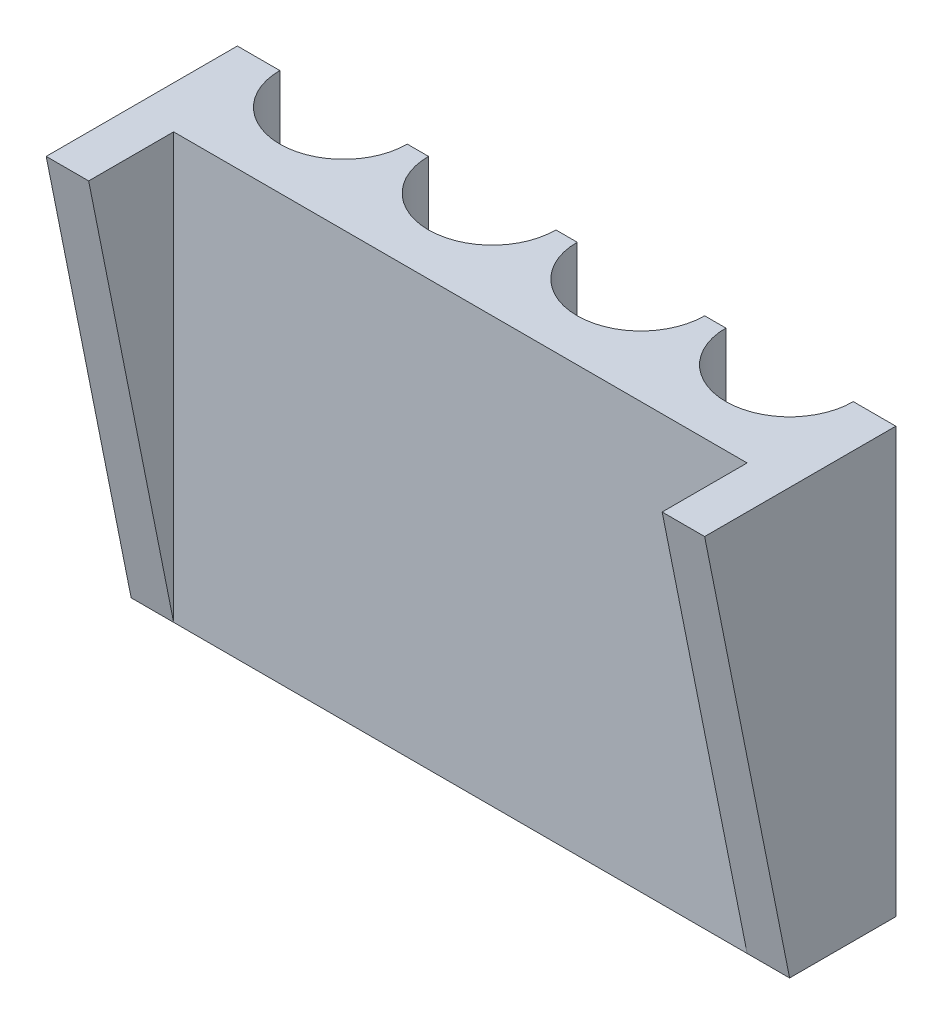
ISO-10303-21;
HEADER;
FILE_DESCRIPTION(('STEP AP214'),'2;1');
FILE_NAME('part.step','',(''),(''),'','','');
FILE_SCHEMA(('AUTOMOTIVE_DESIGN { 1 0 10303 214 1 1 1 1 }'));
ENDSEC;
DATA;
#1=APPLICATION_CONTEXT('core data for automotive mechanical design processes');
#2=APPLICATION_PROTOCOL_DEFINITION('international standard','automotive_design',2000,#1);
#3=PRODUCT_CONTEXT('',#1,'mechanical');
#4=PRODUCT('Part','Part','',(#3));
#5=PRODUCT_RELATED_PRODUCT_CATEGORY('part','',(#4));
#6=PRODUCT_DEFINITION_FORMATION('','',#4);
#7=PRODUCT_DEFINITION_CONTEXT('part definition',#1,'design');
#8=PRODUCT_DEFINITION('design','',#6,#7);
#9=PRODUCT_DEFINITION_SHAPE('','',#8);
#10=(LENGTH_UNIT() NAMED_UNIT(*) SI_UNIT(.MILLI.,.METRE.));
#11=(NAMED_UNIT(*) PLANE_ANGLE_UNIT() SI_UNIT($,.RADIAN.));
#12=(NAMED_UNIT(*) SI_UNIT($,.STERADIAN.) SOLID_ANGLE_UNIT());
#13=UNCERTAINTY_MEASURE_WITH_UNIT(LENGTH_MEASURE(1.E-05),#10,'distance_accuracy_value','');
#14=(GEOMETRIC_REPRESENTATION_CONTEXT(3) GLOBAL_UNCERTAINTY_ASSIGNED_CONTEXT((#13)) GLOBAL_UNIT_ASSIGNED_CONTEXT((#10,
#11,#12)) REPRESENTATION_CONTEXT('',''));
#15=CARTESIAN_POINT('',(0.,0.,0.));
#16=DIRECTION('',(0.,0.,1.));
#17=DIRECTION('',(1.,0.,0.));
#18=AXIS2_PLACEMENT_3D('',#15,#16,#17);
#19=CARTESIAN_POINT('',(-77.4999999999999,100.,-15.));
#20=DIRECTION('',(0.,0.,1.));
#21=DIRECTION('',(1.,0.,0.));
#22=AXIS2_PLACEMENT_3D('',#19,#20,#21);
#23=PLANE('',#22);
#24=DIRECTION('',(-1.,0.,0.));
#25=VECTOR('',#24,1.);
#26=CARTESIAN_POINT('',(38.5000000000001,17.,-15.));
#27=LINE('',#26,#25);
#28=CARTESIAN_POINT('',(-32.4999999999999,17.,-15.));
#29=VERTEX_POINT('',#28);
#30=CARTESIAN_POINT('',(-37.4999999999999,17.,-15.));
#31=VERTEX_POINT('',#30);
#32=EDGE_CURVE('E478',#29,#31,#27,.T.);
#33=ORIENTED_EDGE('',*,*,#32,.F.);
#34=DIRECTION('',(0.,1.,0.));
#35=VECTOR('',#34,1.);
#36=CARTESIAN_POINT('',(-32.4999999999999,10.,-15.));
#37=LINE('',#36,#35);
#38=CARTESIAN_POINT('',(-32.4999999999999,14.,-15.));
#39=VERTEX_POINT('',#38);
#40=EDGE_CURVE('E510',#29,#39,#37,.F.);
#41=ORIENTED_EDGE('',*,*,#40,.T.);
#42=DIRECTION('',(-1.,0.,0.));
#43=VECTOR('',#42,1.);
#44=CARTESIAN_POINT('',(38.5000000000001,14.,-15.));
#45=LINE('',#44,#43);
#46=CARTESIAN_POINT('',(-37.4999999999999,14.,-15.));
#47=VERTEX_POINT('',#46);
#48=EDGE_CURVE('E433',#39,#47,#45,.T.);
#49=ORIENTED_EDGE('',*,*,#48,.T.);
#50=DIRECTION('',(0.,1.,0.));
#51=VECTOR('',#50,1.);
#52=CARTESIAN_POINT('',(-37.5,10.,-15.));
#53=LINE('',#52,#51);
#54=EDGE_CURVE('E521',#47,#31,#53,.T.);
#55=ORIENTED_EDGE('',*,*,#54,.T.);
#56=EDGE_LOOP('',(#33,#41,#49,#55));
#57=FACE_BOUND('',#56,.T.);
#58=ADVANCED_FACE('F33',(#57),#23,.F.);
#59=DIRECTION('',(-1.,0.,0.));
#60=VECTOR('',#59,1.);
#61=CARTESIAN_POINT('',(38.5000000000001,18.,-15.));
#62=LINE('',#61,#60);
#63=CARTESIAN_POINT('',(-32.4999999999999,18.,-15.));
#64=VERTEX_POINT('',#63);
#65=CARTESIAN_POINT('',(-37.5,18.,-15.));
#66=VERTEX_POINT('',#65);
#67=EDGE_CURVE('E481',#64,#66,#62,.T.);
#68=ORIENTED_EDGE('',*,*,#67,.T.);
#69=CARTESIAN_POINT('',(-37.4999999999999,100.,-15.));
#70=VERTEX_POINT('',#69);
#71=EDGE_CURVE('E519',#66,#70,#53,.T.);
#72=ORIENTED_EDGE('',*,*,#71,.T.);
#73=DIRECTION('',(-1.,0.,0.));
#74=VECTOR('',#73,1.);
#75=CARTESIAN_POINT('',(-77.4999999999999,100.,-15.));
#76=LINE('',#75,#74);
#77=CARTESIAN_POINT('',(-32.4999999999999,100.,-15.));
#78=VERTEX_POINT('',#77);
#79=EDGE_CURVE('E580',#78,#70,#76,.T.);
#80=ORIENTED_EDGE('',*,*,#79,.F.);
#81=EDGE_CURVE('E506',#78,#64,#37,.F.);
#82=ORIENTED_EDGE('',*,*,#81,.T.);
#83=EDGE_LOOP('',(#68,#72,#80,#82));
#84=FACE_BOUND('',#83,.T.);
#85=ADVANCED_FACE('F613',(#84),#23,.F.);
#86=CARTESIAN_POINT('',(2.50000000000009,17.,-15.));
#87=VERTEX_POINT('',#86);
#88=CARTESIAN_POINT('',(-2.49999999999993,17.,-15.));
#89=VERTEX_POINT('',#88);
#90=EDGE_CURVE('E477',#87,#89,#27,.T.);
#91=ORIENTED_EDGE('',*,*,#90,.F.);
#92=DIRECTION('',(0.,1.,0.));
#93=VECTOR('',#92,1.);
#94=CARTESIAN_POINT('',(2.50000000000007,10.,-15.));
#95=LINE('',#94,#93);
#96=CARTESIAN_POINT('',(2.50000000000007,14.,-15.));
#97=VERTEX_POINT('',#96);
#98=EDGE_CURVE('E649',#87,#97,#95,.F.);
#99=ORIENTED_EDGE('',*,*,#98,.T.);
#100=CARTESIAN_POINT('',(-2.49999999999994,14.,-15.));
#101=VERTEX_POINT('',#100);
#102=EDGE_CURVE('E432',#97,#101,#45,.T.);
#103=ORIENTED_EDGE('',*,*,#102,.T.);
#104=DIRECTION('',(0.,1.,0.));
#105=VECTOR('',#104,1.);
#106=CARTESIAN_POINT('',(-2.49999999999994,10.,-15.));
#107=LINE('',#106,#105);
#108=EDGE_CURVE('E505',#101,#89,#107,.T.);
#109=ORIENTED_EDGE('',*,*,#108,.T.);
#110=EDGE_LOOP('',(#91,#99,#103,#109));
#111=FACE_BOUND('',#110,.T.);
#112=ADVANCED_FACE('F619',(#111),#23,.F.);
#113=CARTESIAN_POINT('',(2.50000000000007,18.,-15.));
#114=VERTEX_POINT('',#113);
#115=CARTESIAN_POINT('',(-2.49999999999994,18.,-15.));
#116=VERTEX_POINT('',#115);
#117=EDGE_CURVE('E480',#114,#116,#62,.T.);
#118=ORIENTED_EDGE('',*,*,#117,.T.);
#119=CARTESIAN_POINT('',(-2.49999999999994,100.,-15.));
#120=VERTEX_POINT('',#119);
#121=EDGE_CURVE('E493',#116,#120,#107,.T.);
#122=ORIENTED_EDGE('',*,*,#121,.T.);
#123=CARTESIAN_POINT('',(2.50000000000007,100.,-15.));
#124=VERTEX_POINT('',#123);
#125=EDGE_CURVE('E579',#124,#120,#76,.T.);
#126=ORIENTED_EDGE('',*,*,#125,.F.);
#127=EDGE_CURVE('E495',#124,#114,#95,.F.);
#128=ORIENTED_EDGE('',*,*,#127,.T.);
#129=EDGE_LOOP('',(#118,#122,#126,#128));
#130=FACE_BOUND('',#129,.T.);
#131=ADVANCED_FACE('F491',(#130),#23,.F.);
#132=CARTESIAN_POINT('',(52.5000000000001,10.,-15.));
#133=DIRECTION('',(0.,1.,0.));
#134=DIRECTION('',(0.,0.,1.));
#135=AXIS2_PLACEMENT_3D('',#132,#133,#134);
#136=CYLINDRICAL_SURFACE('',#135,15.);
#137=CARTESIAN_POINT('',(52.5000000000001,17.,-15.));
#138=DIRECTION('',(0.,1.,0.));
#139=DIRECTION('',(0.,0.,1.));
#140=AXIS2_PLACEMENT_3D('',#137,#138,#139);
#141=CIRCLE('',#140,15.);
#142=CARTESIAN_POINT('',(37.5333704529043,17.,-14.));
#143=VERTEX_POINT('',#142);
#144=CARTESIAN_POINT('',(37.5000000000001,17.,-15.));
#145=VERTEX_POINT('',#144);
#146=EDGE_CURVE('E462',#143,#145,#141,.F.);
#147=ORIENTED_EDGE('',*,*,#146,.F.);
#148=DIRECTION('',(0.,1.,0.));
#149=VECTOR('',#148,1.);
#150=CARTESIAN_POINT('',(37.5333704529043,10.,-14.));
#151=LINE('',#150,#149);
#152=CARTESIAN_POINT('',(37.5333704529043,18.,-14.));
#153=VERTEX_POINT('',#152);
#154=EDGE_CURVE('E291',#153,#143,#151,.F.);
#155=ORIENTED_EDGE('',*,*,#154,.F.);
#156=CARTESIAN_POINT('',(52.5000000000001,18.,-15.));
#157=DIRECTION('',(0.,-1.,0.));
#158=DIRECTION('',(0.,0.,-1.));
#159=AXIS2_PLACEMENT_3D('',#156,#157,#158);
#160=CIRCLE('',#159,15.);
#161=CARTESIAN_POINT('',(37.5000000000001,18.,-15.));
#162=VERTEX_POINT('',#161);
#163=EDGE_CURVE('E283',#162,#153,#160,.F.);
#164=ORIENTED_EDGE('',*,*,#163,.F.);
#165=DIRECTION('',(0.,1.,0.));
#166=VECTOR('',#165,1.);
#167=CARTESIAN_POINT('',(37.5000000000001,10.,-15.));
#168=LINE('',#167,#166);
#169=CARTESIAN_POINT('',(37.5000000000001,100.,-15.));
#170=VERTEX_POINT('',#169);
#171=EDGE_CURVE('E288',#170,#162,#168,.F.);
#172=ORIENTED_EDGE('',*,*,#171,.F.);
#173=CARTESIAN_POINT('',(52.5000000000001,100.,-15.));
#174=DIRECTION('',(0.,1.,0.));
#175=DIRECTION('',(0.,0.,1.));
#176=AXIS2_PLACEMENT_3D('',#173,#174,#175);
#177=CIRCLE('',#176,15.);
#178=CARTESIAN_POINT('',(67.5000000000001,100.,-15.));
#179=VERTEX_POINT('',#178);
#180=EDGE_CURVE('E547',#170,#179,#177,.T.);
#181=ORIENTED_EDGE('',*,*,#180,.T.);
#182=DIRECTION('',(0.,1.,0.));
#183=VECTOR('',#182,1.);
#184=CARTESIAN_POINT('',(67.5000000000001,10.,-15.));
#185=LINE('',#184,#183);
#186=CARTESIAN_POINT('',(67.5000000000001,10.,-15.));
#187=VERTEX_POINT('',#186);
#188=EDGE_CURVE('E309',#187,#179,#185,.T.);
#189=ORIENTED_EDGE('',*,*,#188,.F.);
#190=CARTESIAN_POINT('',(52.5000000000001,10.,-15.));
#191=DIRECTION('',(0.,1.,0.));
#192=DIRECTION('',(0.,0.,1.));
#193=AXIS2_PLACEMENT_3D('',#190,#191,#192);
#194=CIRCLE('',#193,15.);
#195=CARTESIAN_POINT('',(37.5000000000001,10.,-15.));
#196=VERTEX_POINT('',#195);
#197=EDGE_CURVE('E337',#196,#187,#194,.T.);
#198=ORIENTED_EDGE('',*,*,#197,.F.);
#199=CARTESIAN_POINT('',(37.5000000000001,13.,-15.));
#200=VERTEX_POINT('',#199);
#201=EDGE_CURVE('E312',#200,#196,#168,.F.);
#202=ORIENTED_EDGE('',*,*,#201,.F.);
#203=CARTESIAN_POINT('',(52.5000000000001,13.,-15.));
#204=DIRECTION('',(0.,1.,0.));
#205=DIRECTION('',(0.,0.,1.));
#206=AXIS2_PLACEMENT_3D('',#203,#204,#205);
#207=CIRCLE('',#206,15.);
#208=CARTESIAN_POINT('',(37.5333704529043,13.,-14.));
#209=VERTEX_POINT('',#208);
#210=EDGE_CURVE('E409',#209,#200,#207,.F.);
#211=ORIENTED_EDGE('',*,*,#210,.F.);
#212=DIRECTION('',(0.,1.,0.));
#213=VECTOR('',#212,1.);
#214=CARTESIAN_POINT('',(37.5333704529043,10.,-14.));
#215=LINE('',#214,#213);
#216=CARTESIAN_POINT('',(37.5333704529043,14.,-14.));
#217=VERTEX_POINT('',#216);
#218=EDGE_CURVE('E385',#217,#209,#215,.F.);
#219=ORIENTED_EDGE('',*,*,#218,.F.);
#220=CARTESIAN_POINT('',(52.5000000000001,14.,-15.));
#221=DIRECTION('',(0.,-1.,0.));
#222=DIRECTION('',(0.,0.,-1.));
#223=AXIS2_PLACEMENT_3D('',#220,#221,#222);
#224=CIRCLE('',#223,15.);
#225=CARTESIAN_POINT('',(37.5000000000001,14.,-15.));
#226=VERTEX_POINT('',#225);
#227=EDGE_CURVE('E420',#226,#217,#224,.F.);
#228=ORIENTED_EDGE('',*,*,#227,.F.);
#229=EDGE_CURVE('E310',#145,#226,#168,.F.);
#230=ORIENTED_EDGE('',*,*,#229,.F.);
#231=EDGE_LOOP('',(#147,#155,#164,#172,#181,#189,#198,#202,#211,#219,#228,#230));
#232=FACE_BOUND('',#231,.T.);
#233=ADVANCED_FACE('F286',(#232),#136,.F.);
#234=CARTESIAN_POINT('',(17.5000000000001,10.,-15.));
#235=DIRECTION('',(0.,1.,0.));
#236=DIRECTION('',(0.,0.,1.));
#237=AXIS2_PLACEMENT_3D('',#234,#235,#236);
#238=CYLINDRICAL_SURFACE('',#237,15.);
#239=CARTESIAN_POINT('',(17.5000000000001,17.,-15.));
#240=DIRECTION('',(0.,1.,0.));
#241=DIRECTION('',(0.,0.,1.));
#242=AXIS2_PLACEMENT_3D('',#239,#240,#241);
#243=CIRCLE('',#242,15.);
#244=CARTESIAN_POINT('',(2.5333704529043,17.,-14.));
#245=VERTEX_POINT('',#244);
#246=EDGE_CURVE('E456',#245,#87,#243,.F.);
#247=ORIENTED_EDGE('',*,*,#246,.F.);
#248=DIRECTION('',(0.,1.,0.));
#249=VECTOR('',#248,1.);
#250=CARTESIAN_POINT('',(2.5333704529043,10.,-14.));
#251=LINE('',#250,#249);
#252=CARTESIAN_POINT('',(2.5333704529043,18.,-14.));
#253=VERTEX_POINT('',#252);
#254=EDGE_CURVE('E445',#253,#245,#251,.F.);
#255=ORIENTED_EDGE('',*,*,#254,.F.);
#256=CARTESIAN_POINT('',(17.5000000000001,18.,-15.));
#257=DIRECTION('',(0.,-1.,0.));
#258=DIRECTION('',(0.,0.,-1.));
#259=AXIS2_PLACEMENT_3D('',#256,#257,#258);
#260=CIRCLE('',#259,15.);
#261=EDGE_CURVE('E467',#114,#253,#260,.F.);
#262=ORIENTED_EDGE('',*,*,#261,.F.);
#263=ORIENTED_EDGE('',*,*,#127,.F.);
#264=CARTESIAN_POINT('',(17.5000000000001,100.,-15.));
#265=DIRECTION('',(0.,1.,0.));
#266=DIRECTION('',(0.,0.,1.));
#267=AXIS2_PLACEMENT_3D('',#264,#265,#266);
#268=CIRCLE('',#267,15.);
#269=CARTESIAN_POINT('',(32.5000000000001,100.,-15.));
#270=VERTEX_POINT('',#269);
#271=EDGE_CURVE('E549',#124,#270,#268,.T.);
#272=ORIENTED_EDGE('',*,*,#271,.T.);
#273=DIRECTION('',(0.,1.,0.));
#274=VECTOR('',#273,1.);
#275=CARTESIAN_POINT('',(32.5000000000001,10.,-15.));
#276=LINE('',#275,#274);
#277=CARTESIAN_POINT('',(32.5000000000001,18.,-15.));
#278=VERTEX_POINT('',#277);
#279=EDGE_CURVE('E660',#278,#270,#276,.T.);
#280=ORIENTED_EDGE('',*,*,#279,.F.);
#281=CARTESIAN_POINT('',(32.4666295470958,18.,-14.));
#282=VERTEX_POINT('',#281);
#283=EDGE_CURVE('E294',#282,#278,#260,.F.);
#284=ORIENTED_EDGE('',*,*,#283,.F.);
#285=DIRECTION('',(0.,1.,0.));
#286=VECTOR('',#285,1.);
#287=CARTESIAN_POINT('',(32.4666295470958,10.,-14.));
#288=LINE('',#287,#286);
#289=CARTESIAN_POINT('',(32.4666295470958,17.,-14.));
#290=VERTEX_POINT('',#289);
#291=EDGE_CURVE('E447',#290,#282,#288,.T.);
#292=ORIENTED_EDGE('',*,*,#291,.F.);
#293=CARTESIAN_POINT('',(32.5000000000001,17.,-15.));
#294=VERTEX_POINT('',#293);
#295=EDGE_CURVE('E464',#294,#290,#243,.F.);
#296=ORIENTED_EDGE('',*,*,#295,.F.);
#297=CARTESIAN_POINT('',(32.5000000000001,14.,-15.));
#298=VERTEX_POINT('',#297);
#299=EDGE_CURVE('E664',#298,#294,#276,.T.);
#300=ORIENTED_EDGE('',*,*,#299,.F.);
#301=CARTESIAN_POINT('',(17.5000000000001,14.,-15.));
#302=DIRECTION('',(0.,-1.,0.));
#303=DIRECTION('',(0.,0.,-1.));
#304=AXIS2_PLACEMENT_3D('',#301,#302,#303);
#305=CIRCLE('',#304,15.);
#306=CARTESIAN_POINT('',(32.4666295470958,14.,-14.));
#307=VERTEX_POINT('',#306);
#308=EDGE_CURVE('E423',#307,#298,#305,.F.);
#309=ORIENTED_EDGE('',*,*,#308,.F.);
#310=DIRECTION('',(0.,1.,0.));
#311=VECTOR('',#310,1.);
#312=CARTESIAN_POINT('',(32.4666295470958,10.,-14.));
#313=LINE('',#312,#311);
#314=CARTESIAN_POINT('',(32.4666295470958,13.,-14.));
#315=VERTEX_POINT('',#314);
#316=EDGE_CURVE('E392',#315,#307,#313,.T.);
#317=ORIENTED_EDGE('',*,*,#316,.F.);
#318=CARTESIAN_POINT('',(17.5000000000001,13.,-15.));
#319=DIRECTION('',(0.,1.,0.));
#320=DIRECTION('',(0.,0.,1.));
#321=AXIS2_PLACEMENT_3D('',#318,#319,#320);
#322=CIRCLE('',#321,15.);
#323=CARTESIAN_POINT('',(32.5000000000001,13.,-15.));
#324=VERTEX_POINT('',#323);
#325=EDGE_CURVE('E411',#324,#315,#322,.F.);
#326=ORIENTED_EDGE('',*,*,#325,.F.);
#327=CARTESIAN_POINT('',(32.5000000000001,10.,-15.));
#328=VERTEX_POINT('',#327);
#329=EDGE_CURVE('E662',#328,#324,#276,.T.);
#330=ORIENTED_EDGE('',*,*,#329,.F.);
#331=CARTESIAN_POINT('',(17.5000000000001,10.,-15.));
#332=DIRECTION('',(0.,1.,0.));
#333=DIRECTION('',(0.,0.,1.));
#334=AXIS2_PLACEMENT_3D('',#331,#332,#333);
#335=CIRCLE('',#334,15.);
#336=CARTESIAN_POINT('',(2.50000000000007,10.,-15.));
#337=VERTEX_POINT('',#336);
#338=EDGE_CURVE('E330',#337,#328,#335,.T.);
#339=ORIENTED_EDGE('',*,*,#338,.F.);
#340=CARTESIAN_POINT('',(2.50000000000007,13.,-15.));
#341=VERTEX_POINT('',#340);
#342=EDGE_CURVE('E314',#341,#337,#95,.F.);
#343=ORIENTED_EDGE('',*,*,#342,.F.);
#344=CARTESIAN_POINT('',(2.5333704529043,13.,-14.));
#345=VERTEX_POINT('',#344);
#346=EDGE_CURVE('E403',#345,#341,#322,.F.);
#347=ORIENTED_EDGE('',*,*,#346,.F.);
#348=DIRECTION('',(0.,1.,0.));
#349=VECTOR('',#348,1.);
#350=CARTESIAN_POINT('',(2.5333704529043,10.,-14.));
#351=LINE('',#350,#349);
#352=CARTESIAN_POINT('',(2.5333704529043,14.,-14.));
#353=VERTEX_POINT('',#352);
#354=EDGE_CURVE('E390',#353,#345,#351,.F.);
#355=ORIENTED_EDGE('',*,*,#354,.F.);
#356=EDGE_CURVE('E414',#97,#353,#305,.F.);
#357=ORIENTED_EDGE('',*,*,#356,.F.);
#358=ORIENTED_EDGE('',*,*,#98,.F.);
#359=EDGE_LOOP('',(#247,#255,#262,#263,#272,#280,#284,#292,#296,#300,#309,#317,#326,#330,#339,
#343,#347,#355,#357,#358));
#360=FACE_BOUND('',#359,.T.);
#361=ADVANCED_FACE('F641',(#360),#238,.F.);
#362=CARTESIAN_POINT('',(-17.4999999999999,10.,-15.));
#363=DIRECTION('',(0.,1.,0.));
#364=DIRECTION('',(0.,0.,1.));
#365=AXIS2_PLACEMENT_3D('',#362,#363,#364);
#366=CYLINDRICAL_SURFACE('',#365,15.);
#367=CARTESIAN_POINT('',(-17.4999999999999,17.,-15.));
#368=DIRECTION('',(0.,1.,0.));
#369=DIRECTION('',(0.,0.,1.));
#370=AXIS2_PLACEMENT_3D('',#367,#368,#369);
#371=CIRCLE('',#370,15.);
#372=CARTESIAN_POINT('',(-32.4666295470957,17.,-14.));
#373=VERTEX_POINT('',#372);
#374=EDGE_CURVE('E459',#373,#29,#371,.F.);
#375=ORIENTED_EDGE('',*,*,#374,.F.);
#376=DIRECTION('',(0.,1.,0.));
#377=VECTOR('',#376,1.);
#378=CARTESIAN_POINT('',(-32.4666295470957,10.,-14.));
#379=LINE('',#378,#377);
#380=CARTESIAN_POINT('',(-32.4666295470957,18.,-14.));
#381=VERTEX_POINT('',#380);
#382=EDGE_CURVE('E450',#381,#373,#379,.F.);
#383=ORIENTED_EDGE('',*,*,#382,.F.);
#384=CARTESIAN_POINT('',(-17.4999999999999,18.,-15.));
#385=DIRECTION('',(0.,-1.,0.));
#386=DIRECTION('',(0.,0.,-1.));
#387=AXIS2_PLACEMENT_3D('',#384,#385,#386);
#388=CIRCLE('',#387,15.);
#389=EDGE_CURVE('E470',#64,#381,#388,.F.);
#390=ORIENTED_EDGE('',*,*,#389,.F.);
#391=ORIENTED_EDGE('',*,*,#81,.F.);
#392=CARTESIAN_POINT('',(-17.4999999999999,100.,-15.));
#393=DIRECTION('',(0.,1.,0.));
#394=DIRECTION('',(0.,0.,1.));
#395=AXIS2_PLACEMENT_3D('',#392,#393,#394);
#396=CIRCLE('',#395,15.);
#397=EDGE_CURVE('E503',#78,#120,#396,.T.);
#398=ORIENTED_EDGE('',*,*,#397,.T.);
#399=ORIENTED_EDGE('',*,*,#121,.F.);
#400=CARTESIAN_POINT('',(-2.53337045290418,18.,-14.));
#401=VERTEX_POINT('',#400);
#402=EDGE_CURVE('E468',#401,#116,#388,.F.);
#403=ORIENTED_EDGE('',*,*,#402,.F.);
#404=DIRECTION('',(0.,1.,0.));
#405=VECTOR('',#404,1.);
#406=CARTESIAN_POINT('',(-2.53337045290418,10.,-14.));
#407=LINE('',#406,#405);
#408=CARTESIAN_POINT('',(-2.53337045290418,17.,-14.));
#409=VERTEX_POINT('',#408);
#410=EDGE_CURVE('E452',#409,#401,#407,.T.);
#411=ORIENTED_EDGE('',*,*,#410,.F.);
#412=EDGE_CURVE('E457',#89,#409,#371,.F.);
#413=ORIENTED_EDGE('',*,*,#412,.F.);
#414=ORIENTED_EDGE('',*,*,#108,.F.);
#415=CARTESIAN_POINT('',(-17.4999999999999,14.,-15.));
#416=DIRECTION('',(0.,-1.,0.));
#417=DIRECTION('',(0.,0.,-1.));
#418=AXIS2_PLACEMENT_3D('',#415,#416,#417);
#419=CIRCLE('',#418,15.);
#420=CARTESIAN_POINT('',(-2.53337045290417,14.,-14.));
#421=VERTEX_POINT('',#420);
#422=EDGE_CURVE('E415',#421,#101,#419,.F.);
#423=ORIENTED_EDGE('',*,*,#422,.F.);
#424=DIRECTION('',(0.,1.,0.));
#425=VECTOR('',#424,1.);
#426=CARTESIAN_POINT('',(-2.53337045290417,10.,-14.));
#427=LINE('',#426,#425);
#428=CARTESIAN_POINT('',(-2.53337045290417,13.,-14.));
#429=VERTEX_POINT('',#428);
#430=EDGE_CURVE('E397',#429,#421,#427,.T.);
#431=ORIENTED_EDGE('',*,*,#430,.F.);
#432=CARTESIAN_POINT('',(-17.4999999999999,13.,-15.));
#433=DIRECTION('',(0.,1.,0.));
#434=DIRECTION('',(0.,0.,1.));
#435=AXIS2_PLACEMENT_3D('',#432,#433,#434);
#436=CIRCLE('',#435,15.);
#437=CARTESIAN_POINT('',(-2.49999999999994,13.,-15.));
#438=VERTEX_POINT('',#437);
#439=EDGE_CURVE('E404',#438,#429,#436,.F.);
#440=ORIENTED_EDGE('',*,*,#439,.F.);
#441=CARTESIAN_POINT('',(-2.49999999999994,10.,-15.));
#442=VERTEX_POINT('',#441);
#443=EDGE_CURVE('E508',#442,#438,#107,.T.);
#444=ORIENTED_EDGE('',*,*,#443,.F.);
#445=CARTESIAN_POINT('',(-17.4999999999999,10.,-15.));
#446=DIRECTION('',(0.,1.,0.));
#447=DIRECTION('',(0.,0.,1.));
#448=AXIS2_PLACEMENT_3D('',#445,#446,#447);
#449=CIRCLE('',#448,15.);
#450=CARTESIAN_POINT('',(-32.4999999999999,10.,-15.));
#451=VERTEX_POINT('',#450);
#452=EDGE_CURVE('E324',#451,#442,#449,.T.);
#453=ORIENTED_EDGE('',*,*,#452,.F.);
#454=CARTESIAN_POINT('',(-32.4999999999999,13.,-15.));
#455=VERTEX_POINT('',#454);
#456=EDGE_CURVE('E512',#455,#451,#37,.F.);
#457=ORIENTED_EDGE('',*,*,#456,.F.);
#458=CARTESIAN_POINT('',(-32.4666295470957,13.,-14.));
#459=VERTEX_POINT('',#458);
#460=EDGE_CURVE('E406',#459,#455,#436,.F.);
#461=ORIENTED_EDGE('',*,*,#460,.F.);
#462=DIRECTION('',(0.,1.,0.));
#463=VECTOR('',#462,1.);
#464=CARTESIAN_POINT('',(-32.4666295470957,10.,-14.));
#465=LINE('',#464,#463);
#466=CARTESIAN_POINT('',(-32.4666295470957,14.,-14.));
#467=VERTEX_POINT('',#466);
#468=EDGE_CURVE('E395',#467,#459,#465,.F.);
#469=ORIENTED_EDGE('',*,*,#468,.F.);
#470=EDGE_CURVE('E417',#39,#467,#419,.F.);
#471=ORIENTED_EDGE('',*,*,#470,.F.);
#472=ORIENTED_EDGE('',*,*,#40,.F.);
#473=EDGE_LOOP('',(#375,#383,#390,#391,#398,#399,#403,#411,#413,#414,#423,#431,#440,#444,#453,
#457,#461,#469,#471,#472));
#474=FACE_BOUND('',#473,.T.);
#475=ADVANCED_FACE('F500',(#474),#366,.F.);
#476=CARTESIAN_POINT('',(-52.4999999999999,10.,-15.));
#477=DIRECTION('',(0.,1.,0.));
#478=DIRECTION('',(0.,0.,1.));
#479=AXIS2_PLACEMENT_3D('',#476,#477,#478);
#480=CYLINDRICAL_SURFACE('',#479,15.);
#481=CARTESIAN_POINT('',(-52.4999999999999,17.,-15.));
#482=DIRECTION('',(0.,1.,0.));
#483=DIRECTION('',(0.,0.,1.));
#484=AXIS2_PLACEMENT_3D('',#481,#482,#483);
#485=CIRCLE('',#484,15.);
#486=CARTESIAN_POINT('',(-37.5333704529042,17.,-14.));
#487=VERTEX_POINT('',#486);
#488=EDGE_CURVE('E460',#31,#487,#485,.F.);
#489=ORIENTED_EDGE('',*,*,#488,.F.);
#490=ORIENTED_EDGE('',*,*,#54,.F.);
#491=CARTESIAN_POINT('',(-52.4999999999999,14.,-15.));
#492=DIRECTION('',(0.,-1.,0.));
#493=DIRECTION('',(0.,0.,-1.));
#494=AXIS2_PLACEMENT_3D('',#491,#492,#493);
#495=CIRCLE('',#494,15.);
#496=CARTESIAN_POINT('',(-37.5333704529042,14.,-14.));
#497=VERTEX_POINT('',#496);
#498=EDGE_CURVE('E418',#497,#47,#495,.F.);
#499=ORIENTED_EDGE('',*,*,#498,.F.);
#500=DIRECTION('',(0.,1.,0.));
#501=VECTOR('',#500,1.);
#502=CARTESIAN_POINT('',(-37.5333704529042,10.,-14.));
#503=LINE('',#502,#501);
#504=CARTESIAN_POINT('',(-37.5333704529042,13.,-14.));
#505=VERTEX_POINT('',#504);
#506=EDGE_CURVE('E400',#505,#497,#503,.T.);
#507=ORIENTED_EDGE('',*,*,#506,.F.);
#508=CARTESIAN_POINT('',(-52.4999999999999,13.,-15.));
#509=DIRECTION('',(0.,1.,0.));
#510=DIRECTION('',(0.,0.,1.));
#511=AXIS2_PLACEMENT_3D('',#508,#509,#510);
#512=CIRCLE('',#511,15.);
#513=CARTESIAN_POINT('',(-37.5,13.,-15.));
#514=VERTEX_POINT('',#513);
#515=EDGE_CURVE('E407',#514,#505,#512,.F.);
#516=ORIENTED_EDGE('',*,*,#515,.F.);
#517=CARTESIAN_POINT('',(-37.4999999999999,10.,-15.));
#518=VERTEX_POINT('',#517);
#519=EDGE_CURVE('E523',#518,#514,#53,.T.);
#520=ORIENTED_EDGE('',*,*,#519,.F.);
#521=CARTESIAN_POINT('',(-52.4999999999999,10.,-15.));
#522=DIRECTION('',(0.,1.,0.));
#523=DIRECTION('',(0.,0.,1.));
#524=AXIS2_PLACEMENT_3D('',#521,#522,#523);
#525=CIRCLE('',#524,15.);
#526=CARTESIAN_POINT('',(-67.4999999999999,10.,-15.));
#527=VERTEX_POINT('',#526);
#528=EDGE_CURVE('E317',#527,#518,#525,.T.);
#529=ORIENTED_EDGE('',*,*,#528,.F.);
#530=DIRECTION('',(0.,1.,0.));
#531=VECTOR('',#530,1.);
#532=CARTESIAN_POINT('',(-67.4999999999999,10.,-15.));
#533=LINE('',#532,#531);
#534=CARTESIAN_POINT('',(-67.4999999999999,100.,-15.));
#535=VERTEX_POINT('',#534);
#536=EDGE_CURVE('E515',#535,#527,#533,.F.);
#537=ORIENTED_EDGE('',*,*,#536,.F.);
#538=CARTESIAN_POINT('',(-52.4999999999999,100.,-15.));
#539=DIRECTION('',(0.,1.,0.));
#540=DIRECTION('',(0.,0.,1.));
#541=AXIS2_PLACEMENT_3D('',#538,#539,#540);
#542=CIRCLE('',#541,15.);
#543=EDGE_CURVE('E553',#535,#70,#542,.T.);
#544=ORIENTED_EDGE('',*,*,#543,.T.);
#545=ORIENTED_EDGE('',*,*,#71,.F.);
#546=CARTESIAN_POINT('',(-52.4999999999999,18.,-15.));
#547=DIRECTION('',(0.,-1.,0.));
#548=DIRECTION('',(0.,0.,-1.));
#549=AXIS2_PLACEMENT_3D('',#546,#547,#548);
#550=CIRCLE('',#549,15.);
#551=CARTESIAN_POINT('',(-37.5333704529042,18.,-14.));
#552=VERTEX_POINT('',#551);
#553=EDGE_CURVE('E293',#552,#66,#550,.F.);
#554=ORIENTED_EDGE('',*,*,#553,.F.);
#555=DIRECTION('',(0.,1.,0.));
#556=VECTOR('',#555,1.);
#557=CARTESIAN_POINT('',(-37.5333704529042,10.,-14.));
#558=LINE('',#557,#556);
#559=EDGE_CURVE('E454',#487,#552,#558,.T.);
#560=ORIENTED_EDGE('',*,*,#559,.F.);
#561=EDGE_LOOP('',(#489,#490,#499,#507,#516,#520,#529,#537,#544,#545,#554,#560));
#562=FACE_BOUND('',#561,.T.);
#563=ADVANCED_FACE('F630',(#562),#480,.F.);
#564=ORIENTED_EDGE('',*,*,#171,.T.);
#565=DIRECTION('',(1.,0.,0.));
#566=VECTOR('',#565,1.);
#567=CARTESIAN_POINT('',(37.5000000000001,18.,-15.));
#568=LINE('',#567,#566);
#569=EDGE_CURVE('E297',#278,#162,#568,.T.);
#570=ORIENTED_EDGE('',*,*,#569,.F.);
#571=ORIENTED_EDGE('',*,*,#279,.T.);
#572=EDGE_CURVE('E308',#170,#270,#76,.T.);
#573=ORIENTED_EDGE('',*,*,#572,.F.);
#574=EDGE_LOOP('',(#564,#570,#571,#573));
#575=FACE_BOUND('',#574,.T.);
#576=ADVANCED_FACE('F306',(#575),#23,.F.);
#577=DIRECTION('',(-1.,0.,0.));
#578=VECTOR('',#577,1.);
#579=CARTESIAN_POINT('',(38.5000000000001,13.,-15.));
#580=LINE('',#579,#578);
#581=EDGE_CURVE('E429',#341,#438,#580,.T.);
#582=ORIENTED_EDGE('',*,*,#581,.F.);
#583=ORIENTED_EDGE('',*,*,#342,.T.);
#584=DIRECTION('',(-1.,0.,0.));
#585=VECTOR('',#584,1.);
#586=CARTESIAN_POINT('',(-77.4999999999999,10.,-15.));
#587=LINE('',#586,#585);
#588=EDGE_CURVE('E558',#328,#337,#587,.T.);
#589=ORIENTED_EDGE('',*,*,#588,.F.);
#590=ORIENTED_EDGE('',*,*,#329,.T.);
#591=DIRECTION('',(-1.,0.,0.));
#592=VECTOR('',#591,1.);
#593=CARTESIAN_POINT('',(37.5000000000001,13.,-15.));
#594=LINE('',#593,#592);
#595=EDGE_CURVE('E382',#200,#324,#594,.T.);
#596=ORIENTED_EDGE('',*,*,#595,.F.);
#597=ORIENTED_EDGE('',*,*,#201,.T.);
#598=DIRECTION('',(-1.,0.,0.));
#599=VECTOR('',#598,1.);
#600=CARTESIAN_POINT('',(-77.4999999999999,10.,-15.));
#601=LINE('',#600,#599);
#602=EDGE_CURVE('E556',#187,#196,#601,.T.);
#603=ORIENTED_EDGE('',*,*,#602,.F.);
#604=ORIENTED_EDGE('',*,*,#188,.T.);
#605=CARTESIAN_POINT('',(77.5,100.,-15.));
#606=VERTEX_POINT('',#605);
#607=EDGE_CURVE('E531',#606,#179,#76,.T.);
#608=ORIENTED_EDGE('',*,*,#607,.F.);
#609=DIRECTION('',(0.,-1.,0.));
#610=VECTOR('',#609,1.);
#611=CARTESIAN_POINT('',(77.5,100.,-15.));
#612=LINE('',#611,#610);
#613=CARTESIAN_POINT('',(77.5,0.,-15.));
#614=VERTEX_POINT('',#613);
#615=EDGE_CURVE('E544',#606,#614,#612,.T.);
#616=ORIENTED_EDGE('',*,*,#615,.T.);
#617=DIRECTION('',(-1.,0.,0.));
#618=VECTOR('',#617,1.);
#619=CARTESIAN_POINT('',(-77.4999999999999,0.,-15.));
#620=LINE('',#619,#618);
#621=CARTESIAN_POINT('',(-77.4999999999999,0.,-15.));
#622=VERTEX_POINT('',#621);
#623=EDGE_CURVE('E538',#614,#622,#620,.T.);
#624=ORIENTED_EDGE('',*,*,#623,.T.);
#625=DIRECTION('',(0.,-1.,0.));
#626=VECTOR('',#625,1.);
#627=CARTESIAN_POINT('',(-77.4999999999999,100.,-15.));
#628=LINE('',#627,#626);
#629=CARTESIAN_POINT('',(-77.4999999999999,100.,-15.));
#630=VERTEX_POINT('',#629);
#631=EDGE_CURVE('E536',#630,#622,#628,.T.);
#632=ORIENTED_EDGE('',*,*,#631,.F.);
#633=EDGE_CURVE('E529',#535,#630,#76,.T.);
#634=ORIENTED_EDGE('',*,*,#633,.F.);
#635=ORIENTED_EDGE('',*,*,#536,.T.);
#636=DIRECTION('',(-1.,0.,0.));
#637=VECTOR('',#636,1.);
#638=CARTESIAN_POINT('',(-77.4999999999999,10.,-15.));
#639=LINE('',#638,#637);
#640=EDGE_CURVE('E564',#518,#527,#639,.T.);
#641=ORIENTED_EDGE('',*,*,#640,.F.);
#642=ORIENTED_EDGE('',*,*,#519,.T.);
#643=EDGE_CURVE('E430',#455,#514,#580,.T.);
#644=ORIENTED_EDGE('',*,*,#643,.F.);
#645=ORIENTED_EDGE('',*,*,#456,.T.);
#646=DIRECTION('',(-1.,0.,0.));
#647=VECTOR('',#646,1.);
#648=CARTESIAN_POINT('',(-77.4999999999999,10.,-15.));
#649=LINE('',#648,#647);
#650=EDGE_CURVE('E561',#442,#451,#649,.T.);
#651=ORIENTED_EDGE('',*,*,#650,.F.);
#652=ORIENTED_EDGE('',*,*,#443,.T.);
#653=EDGE_LOOP('',(#582,#583,#589,#590,#596,#597,#603,#604,#608,#616,#624,#632,#634,#635,#641,
#642,#644,#645,#651,#652));
#654=FACE_BOUND('',#653,.T.);
#655=ADVANCED_FACE('F577',(#654),#23,.F.);
#656=ORIENTED_EDGE('',*,*,#299,.T.);
#657=DIRECTION('',(-1.,0.,0.));
#658=VECTOR('',#657,1.);
#659=CARTESIAN_POINT('',(37.5000000000001,17.,-15.));
#660=LINE('',#659,#658);
#661=EDGE_CURVE('E303',#145,#294,#660,.T.);
#662=ORIENTED_EDGE('',*,*,#661,.F.);
#663=ORIENTED_EDGE('',*,*,#229,.T.);
#664=DIRECTION('',(1.,0.,0.));
#665=VECTOR('',#664,1.);
#666=CARTESIAN_POINT('',(37.5000000000001,14.,-15.));
#667=LINE('',#666,#665);
#668=EDGE_CURVE('E378',#298,#226,#667,.T.);
#669=ORIENTED_EDGE('',*,*,#668,.F.);
#670=EDGE_LOOP('',(#656,#662,#663,#669));
#671=FACE_BOUND('',#670,.T.);
#672=ADVANCED_FACE('F622',(#671),#23,.F.);
#673=CARTESIAN_POINT('',(-77.5,100.,30.));
#674=DIRECTION('',(0.,-0.196116135138184,0.98058067569092));
#675=DIRECTION('',(0.,-0.98058067569092,-0.196116135138184));
#676=AXIS2_PLACEMENT_3D('',#673,#674,#675);
#677=PLANE('',#676);
#678=DIRECTION('',(0.,-0.98058067569092,-0.196116135138184));
#679=VECTOR('',#678,1.);
#680=CARTESIAN_POINT('',(-67.5,100.,30.));
#681=LINE('',#680,#679);
#682=CARTESIAN_POINT('',(-67.5,100.,30.));
#683=VERTEX_POINT('',#682);
#684=CARTESIAN_POINT('',(-67.5,0.,10.));
#685=VERTEX_POINT('',#684);
#686=EDGE_CURVE('E11',#683,#685,#681,.T.);
#687=ORIENTED_EDGE('',*,*,#686,.F.);
#688=DIRECTION('',(1.,0.,0.));
#689=VECTOR('',#688,1.);
#690=CARTESIAN_POINT('',(-77.5,100.,30.));
#691=LINE('',#690,#689);
#692=CARTESIAN_POINT('',(-77.5,100.,30.));
#693=VERTEX_POINT('',#692);
#694=EDGE_CURVE('E348',#693,#683,#691,.T.);
#695=ORIENTED_EDGE('',*,*,#694,.F.);
#696=DIRECTION('',(0.,-0.98058067569092,-0.196116135138184));
#697=VECTOR('',#696,1.);
#698=CARTESIAN_POINT('',(-77.5,100.,30.));
#699=LINE('',#698,#697);
#700=CARTESIAN_POINT('',(-77.4999999999999,0.,10.));
#701=VERTEX_POINT('',#700);
#702=EDGE_CURVE('E359',#693,#701,#699,.T.);
#703=ORIENTED_EDGE('',*,*,#702,.T.);
#704=DIRECTION('',(1.,0.,0.));
#705=VECTOR('',#704,1.);
#706=CARTESIAN_POINT('',(77.5,0.,10.));
#707=LINE('',#706,#705);
#708=EDGE_CURVE('E333',#701,#685,#707,.T.);
#709=ORIENTED_EDGE('',*,*,#708,.T.);
#710=EDGE_LOOP('',(#687,#695,#703,#709));
#711=FACE_BOUND('',#710,.T.);
#712=ADVANCED_FACE('F590',(#711),#677,.T.);
#713=CARTESIAN_POINT('',(77.5,100.,-15.));
#714=DIRECTION('',(-1.,0.,0.));
#715=DIRECTION('',(0.,0.,1.));
#716=AXIS2_PLACEMENT_3D('',#713,#714,#715);
#717=PLANE('',#716);
#718=DIRECTION('',(0.,0.,-1.));
#719=VECTOR('',#718,1.);
#720=CARTESIAN_POINT('',(77.5,100.,-15.));
#721=LINE('',#720,#719);
#722=CARTESIAN_POINT('',(77.5,100.,30.));
#723=VERTEX_POINT('',#722);
#724=EDGE_CURVE('E527',#723,#606,#721,.T.);
#725=ORIENTED_EDGE('',*,*,#724,.F.);
#726=DIRECTION('',(0.,-0.98058067569092,-0.196116135138184));
#727=VECTOR('',#726,1.);
#728=CARTESIAN_POINT('',(77.5,100.,30.));
#729=LINE('',#728,#727);
#730=CARTESIAN_POINT('',(77.5,0.,10.));
#731=VERTEX_POINT('',#730);
#732=EDGE_CURVE('E361',#723,#731,#729,.T.);
#733=ORIENTED_EDGE('',*,*,#732,.T.);
#734=DIRECTION('',(0.,0.,-1.));
#735=VECTOR('',#734,1.);
#736=CARTESIAN_POINT('',(77.5,0.,-15.));
#737=LINE('',#736,#735);
#738=EDGE_CURVE('E526',#731,#614,#737,.T.);
#739=ORIENTED_EDGE('',*,*,#738,.T.);
#740=ORIENTED_EDGE('',*,*,#615,.F.);
#741=EDGE_LOOP('',(#725,#733,#739,#740));
#742=FACE_BOUND('',#741,.T.);
#743=ADVANCED_FACE('F35',(#742),#717,.F.);
#744=CARTESIAN_POINT('',(-77.4999999999999,100.,-15.));
#745=DIRECTION('',(1.,0.,0.));
#746=DIRECTION('',(0.,0.,-1.));
#747=AXIS2_PLACEMENT_3D('',#744,#745,#746);
#748=PLANE('',#747);
#749=DIRECTION('',(0.,0.,1.));
#750=VECTOR('',#749,1.);
#751=CARTESIAN_POINT('',(-77.4999999999999,0.,-15.));
#752=LINE('',#751,#750);
#753=EDGE_CURVE('E530',#622,#701,#752,.T.);
#754=ORIENTED_EDGE('',*,*,#753,.T.);
#755=ORIENTED_EDGE('',*,*,#702,.F.);
#756=DIRECTION('',(0.,0.,1.));
#757=VECTOR('',#756,1.);
#758=CARTESIAN_POINT('',(-77.4999999999999,100.,-15.));
#759=LINE('',#758,#757);
#760=EDGE_CURVE('E534',#630,#693,#759,.T.);
#761=ORIENTED_EDGE('',*,*,#760,.F.);
#762=ORIENTED_EDGE('',*,*,#631,.T.);
#763=EDGE_LOOP('',(#754,#755,#761,#762));
#764=FACE_BOUND('',#763,.T.);
#765=ADVANCED_FACE('F589',(#764),#748,.F.);
#766=CARTESIAN_POINT('',(0.,100.,0.));
#767=DIRECTION('',(0.,1.,0.));
#768=DIRECTION('',(0.,0.,1.));
#769=AXIS2_PLACEMENT_3D('',#766,#767,#768);
#770=PLANE('',#769);
#771=DIRECTION('',(0.,0.,1.));
#772=VECTOR('',#771,1.);
#773=CARTESIAN_POINT('',(-67.5,100.,10.));
#774=LINE('',#773,#772);
#775=CARTESIAN_POINT('',(-67.5,100.,10.));
#776=VERTEX_POINT('',#775);
#777=EDGE_CURVE('E375',#776,#683,#774,.T.);
#778=ORIENTED_EDGE('',*,*,#777,.F.);
#779=DIRECTION('',(-1.,0.,0.));
#780=VECTOR('',#779,1.);
#781=CARTESIAN_POINT('',(67.5,100.,10.));
#782=LINE('',#781,#780);
#783=CARTESIAN_POINT('',(67.5,100.,10.));
#784=VERTEX_POINT('',#783);
#785=EDGE_CURVE('E368',#784,#776,#782,.T.);
#786=ORIENTED_EDGE('',*,*,#785,.F.);
#787=DIRECTION('',(0.,0.,-1.));
#788=VECTOR('',#787,1.);
#789=CARTESIAN_POINT('',(67.5,100.,10.));
#790=LINE('',#789,#788);
#791=CARTESIAN_POINT('',(67.5,100.,30.));
#792=VERTEX_POINT('',#791);
#793=EDGE_CURVE('E372',#792,#784,#790,.T.);
#794=ORIENTED_EDGE('',*,*,#793,.F.);
#795=EDGE_CURVE('E355',#792,#723,#691,.T.);
#796=ORIENTED_EDGE('',*,*,#795,.T.);
#797=ORIENTED_EDGE('',*,*,#724,.T.);
#798=ORIENTED_EDGE('',*,*,#607,.T.);
#799=ORIENTED_EDGE('',*,*,#180,.F.);
#800=ORIENTED_EDGE('',*,*,#572,.T.);
#801=ORIENTED_EDGE('',*,*,#271,.F.);
#802=ORIENTED_EDGE('',*,*,#125,.T.);
#803=ORIENTED_EDGE('',*,*,#397,.F.);
#804=ORIENTED_EDGE('',*,*,#79,.T.);
#805=ORIENTED_EDGE('',*,*,#543,.F.);
#806=ORIENTED_EDGE('',*,*,#633,.T.);
#807=ORIENTED_EDGE('',*,*,#760,.T.);
#808=ORIENTED_EDGE('',*,*,#694,.T.);
#809=EDGE_LOOP('',(#778,#786,#794,#796,#797,#798,#799,#800,#801,#802,#803,#804,#805,#806,#807,#808));
#810=FACE_BOUND('',#809,.T.);
#811=ADVANCED_FACE('F570',(#810),#770,.T.);
#812=CARTESIAN_POINT('',(0.,0.,0.));
#813=DIRECTION('',(0.,1.,0.));
#814=DIRECTION('',(0.,0.,1.));
#815=AXIS2_PLACEMENT_3D('',#812,#813,#814);
#816=PLANE('',#815);
#817=ORIENTED_EDGE('',*,*,#738,.F.);
#818=CARTESIAN_POINT('',(67.5,0.,10.));
#819=VERTEX_POINT('',#818);
#820=EDGE_CURVE('E343',#819,#731,#707,.T.);
#821=ORIENTED_EDGE('',*,*,#820,.F.);
#822=EDGE_CURVE('E342',#685,#819,#707,.T.);
#823=ORIENTED_EDGE('',*,*,#822,.F.);
#824=ORIENTED_EDGE('',*,*,#708,.F.);
#825=ORIENTED_EDGE('',*,*,#753,.F.);
#826=ORIENTED_EDGE('',*,*,#623,.F.);
#827=EDGE_LOOP('',(#817,#821,#823,#824,#825,#826));
#828=FACE_BOUND('',#827,.T.);
#829=ADVANCED_FACE('F598',(#828),#816,.F.);
#830=CARTESIAN_POINT('',(52.5000000000001,10.,-15.));
#831=DIRECTION('',(0.,1.,0.));
#832=DIRECTION('',(0.,0.,1.));
#833=AXIS2_PLACEMENT_3D('',#830,#831,#832);
#834=PLANE('',#833);
#835=ORIENTED_EDGE('',*,*,#602,.T.);
#836=ORIENTED_EDGE('',*,*,#197,.T.);
#837=EDGE_LOOP('',(#835,#836));
#838=FACE_BOUND('',#837,.T.);
#839=ADVANCED_FACE('F600',(#838),#834,.T.);
#840=CARTESIAN_POINT('',(17.5000000000001,10.,-15.));
#841=DIRECTION('',(0.,1.,0.));
#842=DIRECTION('',(0.,0.,1.));
#843=AXIS2_PLACEMENT_3D('',#840,#841,#842);
#844=PLANE('',#843);
#845=ORIENTED_EDGE('',*,*,#588,.T.);
#846=ORIENTED_EDGE('',*,*,#338,.T.);
#847=EDGE_LOOP('',(#845,#846));
#848=FACE_BOUND('',#847,.T.);
#849=ADVANCED_FACE('F607',(#848),#844,.T.);
#850=CARTESIAN_POINT('',(-17.4999999999999,10.,-15.));
#851=DIRECTION('',(0.,1.,0.));
#852=DIRECTION('',(0.,0.,1.));
#853=AXIS2_PLACEMENT_3D('',#850,#851,#852);
#854=PLANE('',#853);
#855=ORIENTED_EDGE('',*,*,#650,.T.);
#856=ORIENTED_EDGE('',*,*,#452,.T.);
#857=EDGE_LOOP('',(#855,#856));
#858=FACE_BOUND('',#857,.T.);
#859=ADVANCED_FACE('F708',(#858),#854,.T.);
#860=CARTESIAN_POINT('',(-52.4999999999999,10.,-15.));
#861=DIRECTION('',(0.,1.,0.));
#862=DIRECTION('',(0.,0.,1.));
#863=AXIS2_PLACEMENT_3D('',#860,#861,#862);
#864=PLANE('',#863);
#865=ORIENTED_EDGE('',*,*,#640,.T.);
#866=ORIENTED_EDGE('',*,*,#528,.T.);
#867=EDGE_LOOP('',(#865,#866));
#868=FACE_BOUND('',#867,.T.);
#869=ADVANCED_FACE('F710',(#868),#864,.T.);
#870=DIRECTION('',(0.,0.98058067569092,0.196116135138184));
#871=VECTOR('',#870,1.);
#872=CARTESIAN_POINT('',(67.5,100.,30.));
#873=LINE('',#872,#871);
#874=EDGE_CURVE('E41',#819,#792,#873,.T.);
#875=ORIENTED_EDGE('',*,*,#874,.F.);
#876=ORIENTED_EDGE('',*,*,#820,.T.);
#877=ORIENTED_EDGE('',*,*,#732,.F.);
#878=ORIENTED_EDGE('',*,*,#795,.F.);
#879=EDGE_LOOP('',(#875,#876,#877,#878));
#880=FACE_BOUND('',#879,.T.);
#881=ADVANCED_FACE('F572',(#880),#677,.T.);
#882=CARTESIAN_POINT('',(-67.5,-45.,10.));
#883=DIRECTION('',(-1.,0.,0.));
#884=DIRECTION('',(0.,0.,1.));
#885=AXIS2_PLACEMENT_3D('',#882,#883,#884);
#886=PLANE('',#885);
#887=ORIENTED_EDGE('',*,*,#686,.T.);
#888=DIRECTION('',(0.,1.,0.));
#889=VECTOR('',#888,1.);
#890=CARTESIAN_POINT('',(-67.5,-45.,10.));
#891=LINE('',#890,#889);
#892=EDGE_CURVE('E364',#685,#776,#891,.T.);
#893=ORIENTED_EDGE('',*,*,#892,.T.);
#894=ORIENTED_EDGE('',*,*,#777,.T.);
#895=EDGE_LOOP('',(#887,#893,#894));
#896=FACE_BOUND('',#895,.T.);
#897=ADVANCED_FACE('F593',(#896),#886,.F.);
#898=CARTESIAN_POINT('',(67.5,-45.,10.));
#899=DIRECTION('',(0.,0.,-1.));
#900=DIRECTION('',(-1.,0.,0.));
#901=AXIS2_PLACEMENT_3D('',#898,#899,#900);
#902=PLANE('',#901);
#903=ORIENTED_EDGE('',*,*,#822,.T.);
#904=DIRECTION('',(0.,1.,0.));
#905=VECTOR('',#904,1.);
#906=CARTESIAN_POINT('',(67.5,-45.,10.));
#907=LINE('',#906,#905);
#908=EDGE_CURVE('E366',#819,#784,#907,.T.);
#909=ORIENTED_EDGE('',*,*,#908,.T.);
#910=ORIENTED_EDGE('',*,*,#785,.T.);
#911=ORIENTED_EDGE('',*,*,#892,.F.);
#912=EDGE_LOOP('',(#903,#909,#910,#911));
#913=FACE_BOUND('',#912,.T.);
#914=ADVANCED_FACE('F596',(#913),#902,.F.);
#915=CARTESIAN_POINT('',(67.5,-45.,10.));
#916=DIRECTION('',(1.,0.,0.));
#917=DIRECTION('',(0.,0.,-1.));
#918=AXIS2_PLACEMENT_3D('',#915,#916,#917);
#919=PLANE('',#918);
#920=ORIENTED_EDGE('',*,*,#874,.T.);
#921=ORIENTED_EDGE('',*,*,#793,.T.);
#922=ORIENTED_EDGE('',*,*,#908,.F.);
#923=EDGE_LOOP('',(#920,#921,#922));
#924=FACE_BOUND('',#923,.T.);
#925=ADVANCED_FACE('F567',(#924),#919,.F.);
#926=CARTESIAN_POINT('',(37.5000000000001,14.,-14.));
#927=DIRECTION('',(0.,1.,0.));
#928=DIRECTION('',(0.,0.,1.));
#929=AXIS2_PLACEMENT_3D('',#926,#927,#928);
#930=PLANE('',#929);
#931=ORIENTED_EDGE('',*,*,#668,.T.);
#932=ORIENTED_EDGE('',*,*,#227,.T.);
#933=DIRECTION('',(1.,0.,0.));
#934=VECTOR('',#933,1.);
#935=CARTESIAN_POINT('',(37.5000000000001,14.,-14.));
#936=LINE('',#935,#934);
#937=EDGE_CURVE('E377',#307,#217,#936,.T.);
#938=ORIENTED_EDGE('',*,*,#937,.F.);
#939=ORIENTED_EDGE('',*,*,#308,.T.);
#940=EDGE_LOOP('',(#931,#932,#938,#939));
#941=FACE_BOUND('',#940,.T.);
#942=ADVANCED_FACE('F817',(#941),#930,.F.);
#943=CARTESIAN_POINT('',(37.5000000000001,13.,-14.));
#944=DIRECTION('',(0.,-1.,0.));
#945=DIRECTION('',(0.,0.,-1.));
#946=AXIS2_PLACEMENT_3D('',#943,#944,#945);
#947=PLANE('',#946);
#948=ORIENTED_EDGE('',*,*,#595,.T.);
#949=ORIENTED_EDGE('',*,*,#325,.T.);
#950=DIRECTION('',(-1.,0.,0.));
#951=VECTOR('',#950,1.);
#952=CARTESIAN_POINT('',(37.5000000000001,13.,-14.));
#953=LINE('',#952,#951);
#954=EDGE_CURVE('E381',#209,#315,#953,.T.);
#955=ORIENTED_EDGE('',*,*,#954,.F.);
#956=ORIENTED_EDGE('',*,*,#210,.T.);
#957=EDGE_LOOP('',(#948,#949,#955,#956));
#958=FACE_BOUND('',#957,.T.);
#959=ADVANCED_FACE('F822',(#958),#947,.F.);
#960=CARTESIAN_POINT('',(0.,0.,-14.));
#961=DIRECTION('',(0.,0.,1.));
#962=DIRECTION('',(1.,0.,0.));
#963=AXIS2_PLACEMENT_3D('',#960,#961,#962);
#964=PLANE('',#963);
#965=ORIENTED_EDGE('',*,*,#937,.T.);
#966=ORIENTED_EDGE('',*,*,#218,.T.);
#967=ORIENTED_EDGE('',*,*,#954,.T.);
#968=ORIENTED_EDGE('',*,*,#316,.T.);
#969=EDGE_LOOP('',(#965,#966,#967,#968));
#970=FACE_BOUND('',#969,.T.);
#971=ADVANCED_FACE('F829',(#970),#964,.F.);
#972=CARTESIAN_POINT('',(38.5000000000001,13.,-14.));
#973=DIRECTION('',(0.,1.,0.));
#974=DIRECTION('',(0.,0.,1.));
#975=AXIS2_PLACEMENT_3D('',#972,#973,#974);
#976=PLANE('',#975);
#977=ORIENTED_EDGE('',*,*,#460,.T.);
#978=ORIENTED_EDGE('',*,*,#643,.T.);
#979=ORIENTED_EDGE('',*,*,#515,.T.);
#980=DIRECTION('',(-1.,0.,0.));
#981=VECTOR('',#980,1.);
#982=CARTESIAN_POINT('',(38.5000000000001,13.,-14.));
#983=LINE('',#982,#981);
#984=EDGE_CURVE('E426',#459,#505,#983,.T.);
#985=ORIENTED_EDGE('',*,*,#984,.F.);
#986=EDGE_LOOP('',(#977,#978,#979,#985));
#987=FACE_BOUND('',#986,.T.);
#988=ADVANCED_FACE('F702',(#987),#976,.T.);
#989=CARTESIAN_POINT('',(38.5000000000001,14.,-14.));
#990=DIRECTION('',(0.,-1.,0.));
#991=DIRECTION('',(0.,0.,-1.));
#992=AXIS2_PLACEMENT_3D('',#989,#990,#991);
#993=PLANE('',#992);
#994=ORIENTED_EDGE('',*,*,#470,.T.);
#995=DIRECTION('',(-1.,0.,0.));
#996=VECTOR('',#995,1.);
#997=CARTESIAN_POINT('',(38.5000000000001,14.,-14.));
#998=LINE('',#997,#996);
#999=EDGE_CURVE('E437',#467,#497,#998,.T.);
#1000=ORIENTED_EDGE('',*,*,#999,.T.);
#1001=ORIENTED_EDGE('',*,*,#498,.T.);
#1002=ORIENTED_EDGE('',*,*,#48,.F.);
#1003=EDGE_LOOP('',(#994,#1000,#1001,#1002));
#1004=FACE_BOUND('',#1003,.T.);
#1005=ADVANCED_FACE('F844',(#1004),#993,.T.);
#1006=CARTESIAN_POINT('',(38.5000000000001,14.,-14.));
#1007=DIRECTION('',(0.,0.,-1.));
#1008=DIRECTION('',(-1.,0.,0.));
#1009=AXIS2_PLACEMENT_3D('',#1006,#1007,#1008);
#1010=PLANE('',#1009);
#1011=ORIENTED_EDGE('',*,*,#468,.T.);
#1012=ORIENTED_EDGE('',*,*,#984,.T.);
#1013=ORIENTED_EDGE('',*,*,#506,.T.);
#1014=ORIENTED_EDGE('',*,*,#999,.F.);
#1015=EDGE_LOOP('',(#1011,#1012,#1013,#1014));
#1016=FACE_BOUND('',#1015,.T.);
#1017=ADVANCED_FACE('F851',(#1016),#1010,.T.);
#1018=ORIENTED_EDGE('',*,*,#354,.T.);
#1019=EDGE_CURVE('E425',#345,#429,#983,.T.);
#1020=ORIENTED_EDGE('',*,*,#1019,.T.);
#1021=ORIENTED_EDGE('',*,*,#430,.T.);
#1022=EDGE_CURVE('E436',#353,#421,#998,.T.);
#1023=ORIENTED_EDGE('',*,*,#1022,.F.);
#1024=EDGE_LOOP('',(#1018,#1020,#1021,#1023));
#1025=FACE_BOUND('',#1024,.T.);
#1026=ADVANCED_FACE('F691',(#1025),#1010,.T.);
#1027=ORIENTED_EDGE('',*,*,#346,.T.);
#1028=ORIENTED_EDGE('',*,*,#581,.T.);
#1029=ORIENTED_EDGE('',*,*,#439,.T.);
#1030=ORIENTED_EDGE('',*,*,#1019,.F.);
#1031=EDGE_LOOP('',(#1027,#1028,#1029,#1030));
#1032=FACE_BOUND('',#1031,.T.);
#1033=ADVANCED_FACE('F695',(#1032),#976,.T.);
#1034=ORIENTED_EDGE('',*,*,#356,.T.);
#1035=ORIENTED_EDGE('',*,*,#1022,.T.);
#1036=ORIENTED_EDGE('',*,*,#422,.T.);
#1037=ORIENTED_EDGE('',*,*,#102,.F.);
#1038=EDGE_LOOP('',(#1034,#1035,#1036,#1037));
#1039=FACE_BOUND('',#1038,.T.);
#1040=ADVANCED_FACE('F687',(#1039),#993,.T.);
#1041=CARTESIAN_POINT('',(37.5000000000001,18.,-14.));
#1042=DIRECTION('',(0.,1.,0.));
#1043=DIRECTION('',(0.,0.,1.));
#1044=AXIS2_PLACEMENT_3D('',#1041,#1042,#1043);
#1045=PLANE('',#1044);
#1046=ORIENTED_EDGE('',*,*,#569,.T.);
#1047=ORIENTED_EDGE('',*,*,#163,.T.);
#1048=DIRECTION('',(1.,0.,0.));
#1049=VECTOR('',#1048,1.);
#1050=CARTESIAN_POINT('',(37.5000000000001,18.,-14.));
#1051=LINE('',#1050,#1049);
#1052=EDGE_CURVE('E438',#282,#153,#1051,.T.);
#1053=ORIENTED_EDGE('',*,*,#1052,.F.);
#1054=ORIENTED_EDGE('',*,*,#283,.T.);
#1055=EDGE_LOOP('',(#1046,#1047,#1053,#1054));
#1056=FACE_BOUND('',#1055,.T.);
#1057=ADVANCED_FACE('F298',(#1056),#1045,.F.);
#1058=CARTESIAN_POINT('',(37.5000000000001,17.,-14.));
#1059=DIRECTION('',(0.,-1.,0.));
#1060=DIRECTION('',(0.,0.,-1.));
#1061=AXIS2_PLACEMENT_3D('',#1058,#1059,#1060);
#1062=PLANE('',#1061);
#1063=ORIENTED_EDGE('',*,*,#661,.T.);
#1064=ORIENTED_EDGE('',*,*,#295,.T.);
#1065=DIRECTION('',(-1.,0.,0.));
#1066=VECTOR('',#1065,1.);
#1067=CARTESIAN_POINT('',(37.5000000000001,17.,-14.));
#1068=LINE('',#1067,#1066);
#1069=EDGE_CURVE('E302',#143,#290,#1068,.T.);
#1070=ORIENTED_EDGE('',*,*,#1069,.F.);
#1071=ORIENTED_EDGE('',*,*,#146,.T.);
#1072=EDGE_LOOP('',(#1063,#1064,#1070,#1071));
#1073=FACE_BOUND('',#1072,.T.);
#1074=ADVANCED_FACE('F879',(#1073),#1062,.F.);
#1075=CARTESIAN_POINT('',(0.,0.,-14.));
#1076=DIRECTION('',(0.,0.,1.));
#1077=DIRECTION('',(1.,0.,0.));
#1078=AXIS2_PLACEMENT_3D('',#1075,#1076,#1077);
#1079=PLANE('',#1078);
#1080=ORIENTED_EDGE('',*,*,#1052,.T.);
#1081=ORIENTED_EDGE('',*,*,#154,.T.);
#1082=ORIENTED_EDGE('',*,*,#1069,.T.);
#1083=ORIENTED_EDGE('',*,*,#291,.T.);
#1084=EDGE_LOOP('',(#1080,#1081,#1082,#1083));
#1085=FACE_BOUND('',#1084,.T.);
#1086=ADVANCED_FACE('F886',(#1085),#1079,.F.);
#1087=CARTESIAN_POINT('',(38.5000000000001,17.,-14.));
#1088=DIRECTION('',(0.,1.,0.));
#1089=DIRECTION('',(0.,0.,1.));
#1090=AXIS2_PLACEMENT_3D('',#1087,#1088,#1089);
#1091=PLANE('',#1090);
#1092=ORIENTED_EDGE('',*,*,#374,.T.);
#1093=ORIENTED_EDGE('',*,*,#32,.T.);
#1094=ORIENTED_EDGE('',*,*,#488,.T.);
#1095=DIRECTION('',(-1.,0.,0.));
#1096=VECTOR('',#1095,1.);
#1097=CARTESIAN_POINT('',(38.5000000000001,17.,-14.));
#1098=LINE('',#1097,#1096);
#1099=EDGE_CURVE('E474',#373,#487,#1098,.T.);
#1100=ORIENTED_EDGE('',*,*,#1099,.F.);
#1101=EDGE_LOOP('',(#1092,#1093,#1094,#1100));
#1102=FACE_BOUND('',#1101,.T.);
#1103=ADVANCED_FACE('F894',(#1102),#1091,.T.);
#1104=CARTESIAN_POINT('',(38.5000000000001,18.,-14.));
#1105=DIRECTION('',(0.,-1.,0.));
#1106=DIRECTION('',(0.,0.,-1.));
#1107=AXIS2_PLACEMENT_3D('',#1104,#1105,#1106);
#1108=PLANE('',#1107);
#1109=ORIENTED_EDGE('',*,*,#389,.T.);
#1110=DIRECTION('',(-1.,0.,0.));
#1111=VECTOR('',#1110,1.);
#1112=CARTESIAN_POINT('',(38.5000000000001,18.,-14.));
#1113=LINE('',#1112,#1111);
#1114=EDGE_CURVE('E56',#381,#552,#1113,.T.);
#1115=ORIENTED_EDGE('',*,*,#1114,.T.);
#1116=ORIENTED_EDGE('',*,*,#553,.T.);
#1117=ORIENTED_EDGE('',*,*,#67,.F.);
#1118=EDGE_LOOP('',(#1109,#1115,#1116,#1117));
#1119=FACE_BOUND('',#1118,.T.);
#1120=ADVANCED_FACE('F668',(#1119),#1108,.T.);
#1121=CARTESIAN_POINT('',(38.5000000000001,18.,-14.));
#1122=DIRECTION('',(0.,0.,-1.));
#1123=DIRECTION('',(-1.,0.,0.));
#1124=AXIS2_PLACEMENT_3D('',#1121,#1122,#1123);
#1125=PLANE('',#1124);
#1126=ORIENTED_EDGE('',*,*,#382,.T.);
#1127=ORIENTED_EDGE('',*,*,#1099,.T.);
#1128=ORIENTED_EDGE('',*,*,#559,.T.);
#1129=ORIENTED_EDGE('',*,*,#1114,.F.);
#1130=EDGE_LOOP('',(#1126,#1127,#1128,#1129));
#1131=FACE_BOUND('',#1130,.T.);
#1132=ADVANCED_FACE('F671',(#1131),#1125,.T.);
#1133=ORIENTED_EDGE('',*,*,#254,.T.);
#1134=EDGE_CURVE('E473',#245,#409,#1098,.T.);
#1135=ORIENTED_EDGE('',*,*,#1134,.T.);
#1136=ORIENTED_EDGE('',*,*,#410,.T.);
#1137=EDGE_CURVE('E48',#253,#401,#1113,.T.);
#1138=ORIENTED_EDGE('',*,*,#1137,.F.);
#1139=EDGE_LOOP('',(#1133,#1135,#1136,#1138));
#1140=FACE_BOUND('',#1139,.T.);
#1141=ADVANCED_FACE('F682',(#1140),#1125,.T.);
#1142=ORIENTED_EDGE('',*,*,#246,.T.);
#1143=ORIENTED_EDGE('',*,*,#90,.T.);
#1144=ORIENTED_EDGE('',*,*,#412,.T.);
#1145=ORIENTED_EDGE('',*,*,#1134,.F.);
#1146=EDGE_LOOP('',(#1142,#1143,#1144,#1145));
#1147=FACE_BOUND('',#1146,.T.);
#1148=ADVANCED_FACE('F679',(#1147),#1091,.T.);
#1149=ORIENTED_EDGE('',*,*,#261,.T.);
#1150=ORIENTED_EDGE('',*,*,#1137,.T.);
#1151=ORIENTED_EDGE('',*,*,#402,.T.);
#1152=ORIENTED_EDGE('',*,*,#117,.F.);
#1153=EDGE_LOOP('',(#1149,#1150,#1151,#1152));
#1154=FACE_BOUND('',#1153,.T.);
#1155=ADVANCED_FACE('F909',(#1154),#1108,.T.);
#1156=CLOSED_SHELL('',(#58,#85,#112,#131,#233,#361,#475,#563,#576,#655,#672,#712,#743,#765,#811,
#829,#839,#849,#859,#869,#881,#897,#914,#925,#942,#959,#971,#988,#1005,#1017,#1026,#1033,#1040,
#1057,#1074,#1086,#1103,#1120,#1132,#1141,#1148,#1155));
#1157=MANIFOLD_SOLID_BREP('B2',#1156);
#1158=ADVANCED_BREP_SHAPE_REPRESENTATION('',(#18,#1157),#14);
#1159=SHAPE_DEFINITION_REPRESENTATION(#9,#1158);
ENDSEC;
END-ISO-10303-21;
